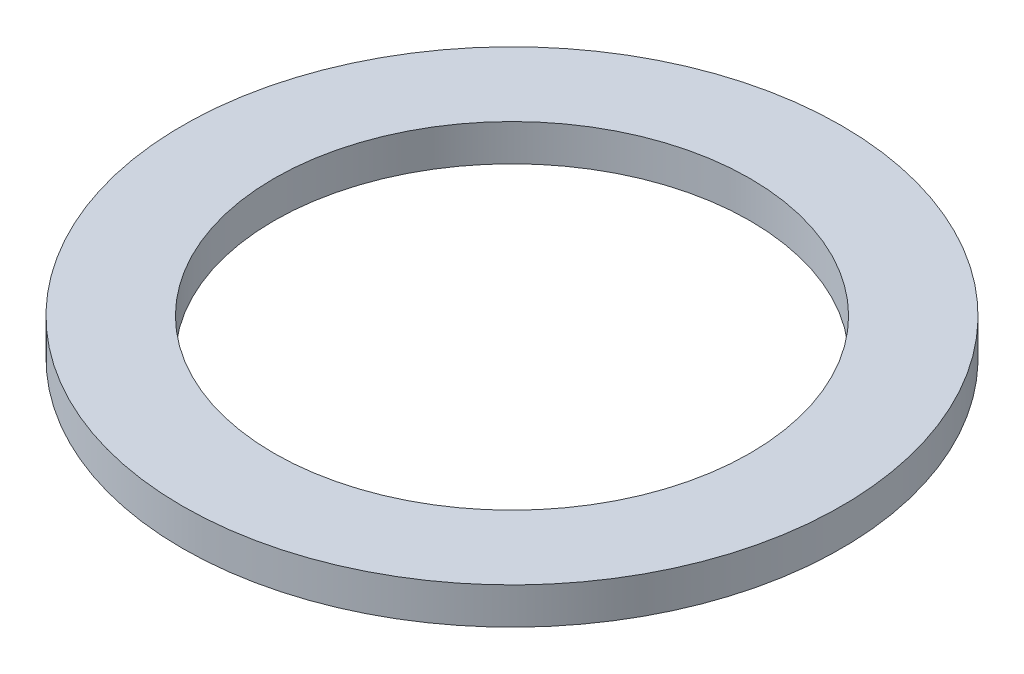
ISO-10303-21;
HEADER;
FILE_DESCRIPTION(('STEP AP214'),'2;1');
FILE_NAME('part.step','',(''),(''),'','','');
FILE_SCHEMA(('AUTOMOTIVE_DESIGN { 1 0 10303 214 1 1 1 1 }'));
ENDSEC;
DATA;
#1=APPLICATION_CONTEXT('core data for automotive mechanical design processes');
#2=APPLICATION_PROTOCOL_DEFINITION('international standard','automotive_design',2000,#1);
#3=PRODUCT_CONTEXT('',#1,'mechanical');
#4=PRODUCT('Part','Part','',(#3));
#5=PRODUCT_RELATED_PRODUCT_CATEGORY('part','',(#4));
#6=PRODUCT_DEFINITION_FORMATION('','',#4);
#7=PRODUCT_DEFINITION_CONTEXT('part definition',#1,'design');
#8=PRODUCT_DEFINITION('design','',#6,#7);
#9=PRODUCT_DEFINITION_SHAPE('','',#8);
#10=(LENGTH_UNIT() NAMED_UNIT(*) SI_UNIT(.MILLI.,.METRE.));
#11=(NAMED_UNIT(*) PLANE_ANGLE_UNIT() SI_UNIT($,.RADIAN.));
#12=(NAMED_UNIT(*) SI_UNIT($,.STERADIAN.) SOLID_ANGLE_UNIT());
#13=UNCERTAINTY_MEASURE_WITH_UNIT(LENGTH_MEASURE(1.E-05),#10,'distance_accuracy_value','');
#14=(GEOMETRIC_REPRESENTATION_CONTEXT(3) GLOBAL_UNCERTAINTY_ASSIGNED_CONTEXT((#13)) GLOBAL_UNIT_ASSIGNED_CONTEXT((#10,
#11,#12)) REPRESENTATION_CONTEXT('',''));
#15=CARTESIAN_POINT('',(0.,0.,0.));
#16=DIRECTION('',(0.,0.,1.));
#17=DIRECTION('',(1.,0.,0.));
#18=AXIS2_PLACEMENT_3D('',#15,#16,#17);
#19=CARTESIAN_POINT('',(0.,5.,0.));
#20=DIRECTION('',(0.,-1.,0.));
#21=DIRECTION('',(0.,0.,-1.));
#22=AXIS2_PLACEMENT_3D('',#19,#20,#21);
#23=CYLINDRICAL_SURFACE('',#22,32.5);
#24=CARTESIAN_POINT('',(0.,5.,0.));
#25=DIRECTION('',(0.,1.,0.));
#26=DIRECTION('',(0.,0.,1.));
#27=AXIS2_PLACEMENT_3D('',#24,#25,#26);
#28=CIRCLE('',#27,32.5);
#29=CARTESIAN_POINT('',(0.,5.,32.5));
#30=VERTEX_POINT('',#29);
#31=EDGE_CURVE('E59',#30,#30,#28,.T.);
#32=ORIENTED_EDGE('',*,*,#31,.T.);
#33=EDGE_LOOP('',(#32));
#34=FACE_BOUND('',#33,.T.);
#35=CARTESIAN_POINT('',(0.,0.,0.));
#36=DIRECTION('',(0.,1.,0.));
#37=DIRECTION('',(0.,0.,1.));
#38=AXIS2_PLACEMENT_3D('',#35,#36,#37);
#39=CIRCLE('',#38,32.5);
#40=CARTESIAN_POINT('',(0.,0.,32.5));
#41=VERTEX_POINT('',#40);
#42=EDGE_CURVE('E65',#41,#41,#39,.T.);
#43=ORIENTED_EDGE('',*,*,#42,.F.);
#44=EDGE_LOOP('',(#43));
#45=FACE_BOUND('',#44,.T.);
#46=ADVANCED_FACE('F52',(#34,#45),#23,.F.);
#47=CARTESIAN_POINT('',(0.,0.,0.));
#48=DIRECTION('',(0.,1.,0.));
#49=DIRECTION('',(0.,0.,1.));
#50=AXIS2_PLACEMENT_3D('',#47,#48,#49);
#51=PLANE('',#50);
#52=ORIENTED_EDGE('',*,*,#42,.T.);
#53=EDGE_LOOP('',(#52));
#54=FACE_BOUND('',#53,.T.);
#55=CARTESIAN_POINT('',(0.,0.,0.));
#56=DIRECTION('',(0.,1.,0.));
#57=DIRECTION('',(0.,0.,1.));
#58=AXIS2_PLACEMENT_3D('',#55,#56,#57);
#59=CIRCLE('',#58,45.);
#60=CARTESIAN_POINT('',(0.,0.,45.));
#61=VERTEX_POINT('',#60);
#62=EDGE_CURVE('E55',#61,#61,#59,.T.);
#63=ORIENTED_EDGE('',*,*,#62,.F.);
#64=EDGE_LOOP('',(#63));
#65=FACE_BOUND('',#64,.T.);
#66=ADVANCED_FACE('F74',(#54,#65),#51,.F.);
#67=CARTESIAN_POINT('',(0.,5.,0.));
#68=DIRECTION('',(0.,-1.,0.));
#69=DIRECTION('',(0.,0.,-1.));
#70=AXIS2_PLACEMENT_3D('',#67,#68,#69);
#71=CYLINDRICAL_SURFACE('',#70,45.);
#72=CARTESIAN_POINT('',(0.,5.,0.));
#73=DIRECTION('',(0.,1.,0.));
#74=DIRECTION('',(0.,0.,1.));
#75=AXIS2_PLACEMENT_3D('',#72,#73,#74);
#76=CIRCLE('',#75,45.);
#77=CARTESIAN_POINT('',(0.,5.,45.));
#78=VERTEX_POINT('',#77);
#79=EDGE_CURVE('E11',#78,#78,#76,.T.);
#80=ORIENTED_EDGE('',*,*,#79,.F.);
#81=EDGE_LOOP('',(#80));
#82=FACE_BOUND('',#81,.T.);
#83=ORIENTED_EDGE('',*,*,#62,.T.);
#84=EDGE_LOOP('',(#83));
#85=FACE_BOUND('',#84,.T.);
#86=ADVANCED_FACE('F72',(#82,#85),#71,.T.);
#87=CARTESIAN_POINT('',(0.,5.,0.));
#88=DIRECTION('',(0.,1.,0.));
#89=DIRECTION('',(0.,0.,1.));
#90=AXIS2_PLACEMENT_3D('',#87,#88,#89);
#91=PLANE('',#90);
#92=ORIENTED_EDGE('',*,*,#31,.F.);
#93=EDGE_LOOP('',(#92));
#94=FACE_BOUND('',#93,.T.);
#95=ORIENTED_EDGE('',*,*,#79,.T.);
#96=EDGE_LOOP('',(#95));
#97=FACE_BOUND('',#96,.T.);
#98=ADVANCED_FACE('F81',(#94,#97),#91,.T.);
#99=CLOSED_SHELL('',(#46,#66,#86,#98));
#100=MANIFOLD_SOLID_BREP('B2',#99);
#101=ADVANCED_BREP_SHAPE_REPRESENTATION('',(#18,#100),#14);
#102=SHAPE_DEFINITION_REPRESENTATION(#9,#101);
ENDSEC;
END-ISO-10303-21;
